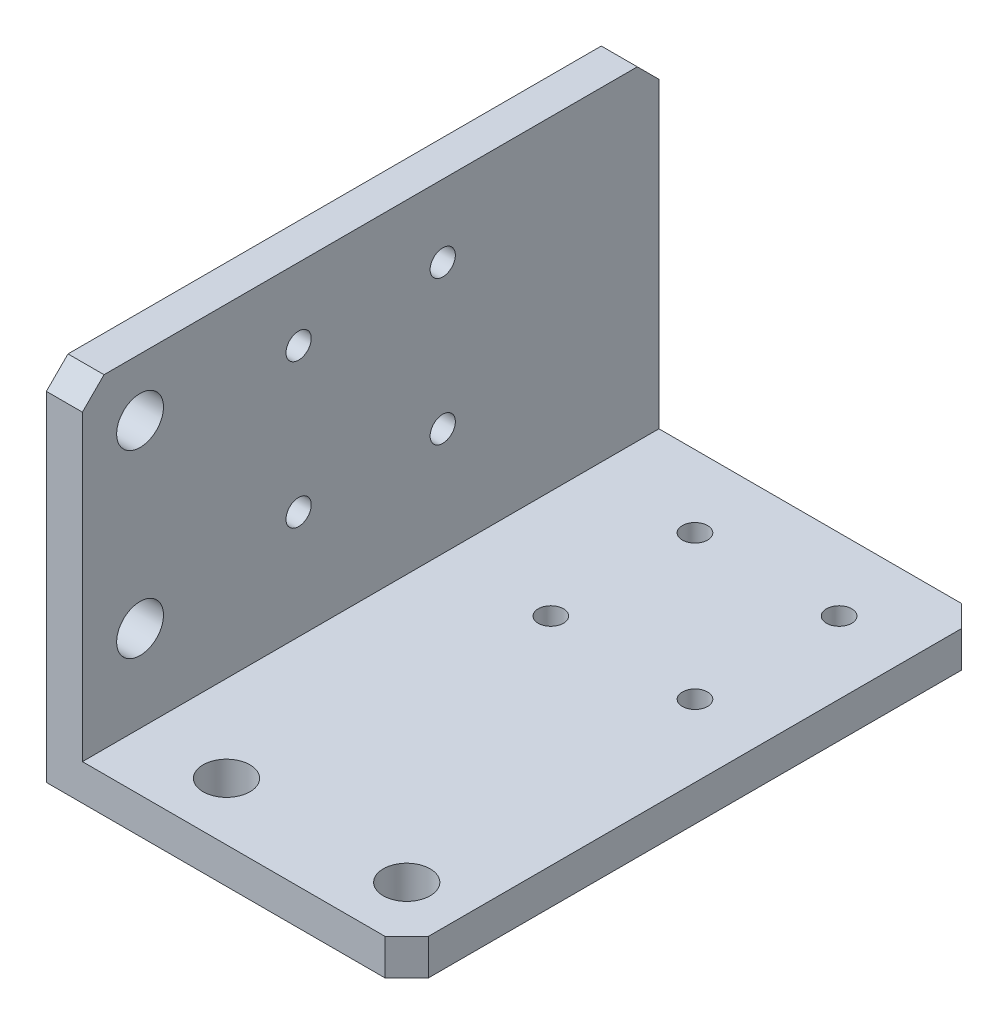
ISO-10303-21;
HEADER;
FILE_DESCRIPTION(('STEP AP214'),'2;1');
FILE_NAME('part.step','',(''),(''),'','','');
FILE_SCHEMA(('AUTOMOTIVE_DESIGN { 1 0 10303 214 1 1 1 1 }'));
ENDSEC;
DATA;
#1=APPLICATION_CONTEXT('core data for automotive mechanical design processes');
#2=APPLICATION_PROTOCOL_DEFINITION('international standard','automotive_design',2000,#1);
#3=PRODUCT_CONTEXT('',#1,'mechanical');
#4=PRODUCT('Part','Part','',(#3));
#5=PRODUCT_RELATED_PRODUCT_CATEGORY('part','',(#4));
#6=PRODUCT_DEFINITION_FORMATION('','',#4);
#7=PRODUCT_DEFINITION_CONTEXT('part definition',#1,'design');
#8=PRODUCT_DEFINITION('design','',#6,#7);
#9=PRODUCT_DEFINITION_SHAPE('','',#8);
#10=(LENGTH_UNIT() NAMED_UNIT(*) SI_UNIT(.MILLI.,.METRE.));
#11=(NAMED_UNIT(*) PLANE_ANGLE_UNIT() SI_UNIT($,.RADIAN.));
#12=(NAMED_UNIT(*) SI_UNIT($,.STERADIAN.) SOLID_ANGLE_UNIT());
#13=UNCERTAINTY_MEASURE_WITH_UNIT(LENGTH_MEASURE(1.E-05),#10,'distance_accuracy_value','');
#14=(GEOMETRIC_REPRESENTATION_CONTEXT(3) GLOBAL_UNCERTAINTY_ASSIGNED_CONTEXT((#13)) GLOBAL_UNIT_ASSIGNED_CONTEXT((#10,
#11,#12)) REPRESENTATION_CONTEXT('',''));
#15=CARTESIAN_POINT('',(0.,0.,0.));
#16=DIRECTION('',(0.,0.,1.));
#17=DIRECTION('',(1.,0.,0.));
#18=AXIS2_PLACEMENT_3D('',#15,#16,#17);
#19=CARTESIAN_POINT('',(50.,0.,80.));
#20=DIRECTION('',(0.,1.,0.));
#21=DIRECTION('',(-1.,0.,0.));
#22=AXIS2_PLACEMENT_3D('',#19,#20,#21);
#23=PLANE('',#22);
#24=CARTESIAN_POINT('',(40.,0.,10.));
#25=DIRECTION('',(0.,-1.,0.));
#26=DIRECTION('',(1.,0.,0.));
#27=AXIS2_PLACEMENT_3D('',#24,#25,#26);
#28=CIRCLE('',#27,1.75000000000001);
#29=CARTESIAN_POINT('',(41.7500000000001,0.,10.));
#30=VERTEX_POINT('',#29);
#31=EDGE_CURVE('E242',#30,#30,#28,.T.);
#32=ORIENTED_EDGE('',*,*,#31,.F.);
#33=EDGE_LOOP('',(#32));
#34=FACE_BOUND('',#33,.T.);
#35=CARTESIAN_POINT('',(40.,0.,30.));
#36=DIRECTION('',(0.,-1.,0.));
#37=DIRECTION('',(1.,0.,0.));
#38=AXIS2_PLACEMENT_3D('',#35,#36,#37);
#39=CIRCLE('',#38,1.75000000000001);
#40=CARTESIAN_POINT('',(41.75,0.,30.));
#41=VERTEX_POINT('',#40);
#42=EDGE_CURVE('E236',#41,#41,#39,.T.);
#43=ORIENTED_EDGE('',*,*,#42,.F.);
#44=EDGE_LOOP('',(#43));
#45=FACE_BOUND('',#44,.T.);
#46=CARTESIAN_POINT('',(20.,0.,30.));
#47=DIRECTION('',(0.,-1.,0.));
#48=DIRECTION('',(1.,0.,0.));
#49=AXIS2_PLACEMENT_3D('',#46,#47,#48);
#50=CIRCLE('',#49,1.75000000000001);
#51=CARTESIAN_POINT('',(21.75,0.,30.));
#52=VERTEX_POINT('',#51);
#53=EDGE_CURVE('E230',#52,#52,#50,.T.);
#54=ORIENTED_EDGE('',*,*,#53,.F.);
#55=EDGE_LOOP('',(#54));
#56=FACE_BOUND('',#55,.T.);
#57=CARTESIAN_POINT('',(20.,0.,9.99999999999996));
#58=DIRECTION('',(0.,-1.,0.));
#59=DIRECTION('',(1.,0.,0.));
#60=AXIS2_PLACEMENT_3D('',#57,#58,#59);
#61=CIRCLE('',#60,1.75);
#62=CARTESIAN_POINT('',(21.75,0.,9.99999999999996));
#63=VERTEX_POINT('',#62);
#64=EDGE_CURVE('E224',#63,#63,#61,.T.);
#65=ORIENTED_EDGE('',*,*,#64,.F.);
#66=EDGE_LOOP('',(#65));
#67=FACE_BOUND('',#66,.T.);
#68=CARTESIAN_POINT('',(17.,0.,72.));
#69=DIRECTION('',(0.,-1.,0.));
#70=DIRECTION('',(0.,0.,-1.));
#71=AXIS2_PLACEMENT_3D('',#68,#69,#70);
#72=CIRCLE('',#71,3.24999999999999);
#73=CARTESIAN_POINT('',(17.,0.,68.75));
#74=VERTEX_POINT('',#73);
#75=EDGE_CURVE('E206',#74,#74,#72,.T.);
#76=ORIENTED_EDGE('',*,*,#75,.F.);
#77=EDGE_LOOP('',(#76));
#78=FACE_BOUND('',#77,.T.);
#79=CARTESIAN_POINT('',(42.,0.,72.));
#80=DIRECTION('',(0.,-1.,0.));
#81=DIRECTION('',(0.,0.,-1.));
#82=AXIS2_PLACEMENT_3D('',#79,#80,#81);
#83=CIRCLE('',#82,3.24999999999999);
#84=CARTESIAN_POINT('',(42.,0.,68.75));
#85=VERTEX_POINT('',#84);
#86=EDGE_CURVE('E166',#85,#85,#83,.T.);
#87=ORIENTED_EDGE('',*,*,#86,.F.);
#88=EDGE_LOOP('',(#87));
#89=FACE_BOUND('',#88,.T.);
#90=DIRECTION('',(1.,0.,0.));
#91=VECTOR('',#90,1.);
#92=CARTESIAN_POINT('',(50.,0.,0.));
#93=LINE('',#92,#91);
#94=CARTESIAN_POINT('',(0.,0.,0.));
#95=VERTEX_POINT('',#94);
#96=CARTESIAN_POINT('',(47.,0.,0.));
#97=VERTEX_POINT('',#96);
#98=EDGE_CURVE('E143',#95,#97,#93,.T.);
#99=ORIENTED_EDGE('',*,*,#98,.T.);
#100=DIRECTION('',(0.707106781186548,0.,0.707106781186548));
#101=VECTOR('',#100,1.);
#102=CARTESIAN_POINT('',(50.,0.,3.00000000000002));
#103=LINE('',#102,#101);
#104=CARTESIAN_POINT('',(50.,0.,3.00000000000004));
#105=VERTEX_POINT('',#104);
#106=EDGE_CURVE('E191',#97,#105,#103,.T.);
#107=ORIENTED_EDGE('',*,*,#106,.T.);
#108=DIRECTION('',(0.,0.,-1.));
#109=VECTOR('',#108,1.);
#110=CARTESIAN_POINT('',(50.,0.,80.));
#111=LINE('',#110,#109);
#112=CARTESIAN_POINT('',(50.,0.,77.));
#113=VERTEX_POINT('',#112);
#114=EDGE_CURVE('E160',#113,#105,#111,.T.);
#115=ORIENTED_EDGE('',*,*,#114,.F.);
#116=DIRECTION('',(0.707106781186544,0.,-0.707106781186551));
#117=VECTOR('',#116,1.);
#118=CARTESIAN_POINT('',(47.,0.,80.));
#119=LINE('',#118,#117);
#120=CARTESIAN_POINT('',(47.,0.,80.));
#121=VERTEX_POINT('',#120);
#122=EDGE_CURVE('E47',#113,#121,#119,.F.);
#123=ORIENTED_EDGE('',*,*,#122,.T.);
#124=DIRECTION('',(1.,0.,0.));
#125=VECTOR('',#124,1.);
#126=CARTESIAN_POINT('',(50.,0.,80.));
#127=LINE('',#126,#125);
#128=CARTESIAN_POINT('',(0.,0.,80.));
#129=VERTEX_POINT('',#128);
#130=EDGE_CURVE('E119',#129,#121,#127,.T.);
#131=ORIENTED_EDGE('',*,*,#130,.F.);
#132=DIRECTION('',(0.,0.,-1.));
#133=VECTOR('',#132,1.);
#134=CARTESIAN_POINT('',(0.,0.,80.));
#135=LINE('',#134,#133);
#136=EDGE_CURVE('E139',#129,#95,#135,.T.);
#137=ORIENTED_EDGE('',*,*,#136,.T.);
#138=EDGE_LOOP('',(#99,#107,#115,#123,#131,#137));
#139=FACE_BOUND('',#138,.T.);
#140=ADVANCED_FACE('F32',(#34,#45,#56,#67,#78,#89,#139),#23,.F.);
#141=CARTESIAN_POINT('',(50.,5.,80.));
#142=DIRECTION('',(-1.,0.,0.));
#143=DIRECTION('',(0.,0.,1.));
#144=AXIS2_PLACEMENT_3D('',#141,#142,#143);
#145=PLANE('',#144);
#146=ORIENTED_EDGE('',*,*,#114,.T.);
#147=DIRECTION('',(0.,1.,0.));
#148=VECTOR('',#147,1.);
#149=CARTESIAN_POINT('',(50.,5.,3.00000000000002));
#150=LINE('',#149,#148);
#151=CARTESIAN_POINT('',(50.,5.,3.00000000000004));
#152=VERTEX_POINT('',#151);
#153=EDGE_CURVE('E184',#105,#152,#150,.T.);
#154=ORIENTED_EDGE('',*,*,#153,.T.);
#155=DIRECTION('',(0.,0.,-1.));
#156=VECTOR('',#155,1.);
#157=CARTESIAN_POINT('',(50.,5.,80.));
#158=LINE('',#157,#156);
#159=CARTESIAN_POINT('',(50.,5.,77.));
#160=VERTEX_POINT('',#159);
#161=EDGE_CURVE('E130',#160,#152,#158,.T.);
#162=ORIENTED_EDGE('',*,*,#161,.F.);
#163=DIRECTION('',(0.,-1.,0.));
#164=VECTOR('',#163,1.);
#165=CARTESIAN_POINT('',(50.,5.,77.));
#166=LINE('',#165,#164);
#167=EDGE_CURVE('E182',#160,#113,#166,.T.);
#168=ORIENTED_EDGE('',*,*,#167,.T.);
#169=EDGE_LOOP('',(#146,#154,#162,#168));
#170=FACE_BOUND('',#169,.T.);
#171=ADVANCED_FACE('F305',(#170),#145,.F.);
#172=CARTESIAN_POINT('',(5.00000000000001,5.,80.));
#173=DIRECTION('',(0.,-1.,0.));
#174=DIRECTION('',(1.,0.,0.));
#175=AXIS2_PLACEMENT_3D('',#172,#173,#174);
#176=PLANE('',#175);
#177=CARTESIAN_POINT('',(40.0000000000001,5.,10.));
#178=DIRECTION('',(0.,-1.,0.));
#179=DIRECTION('',(1.,0.,0.));
#180=AXIS2_PLACEMENT_3D('',#177,#178,#179);
#181=CIRCLE('',#180,1.75000000000001);
#182=CARTESIAN_POINT('',(41.7500000000001,5.,10.));
#183=VERTEX_POINT('',#182);
#184=EDGE_CURVE('E239',#183,#183,#181,.F.);
#185=ORIENTED_EDGE('',*,*,#184,.F.);
#186=EDGE_LOOP('',(#185));
#187=FACE_BOUND('',#186,.T.);
#188=CARTESIAN_POINT('',(40.,5.,30.));
#189=DIRECTION('',(0.,-1.,0.));
#190=DIRECTION('',(1.,0.,0.));
#191=AXIS2_PLACEMENT_3D('',#188,#189,#190);
#192=CIRCLE('',#191,1.75000000000001);
#193=CARTESIAN_POINT('',(41.75,5.,30.));
#194=VERTEX_POINT('',#193);
#195=EDGE_CURVE('E233',#194,#194,#192,.F.);
#196=ORIENTED_EDGE('',*,*,#195,.F.);
#197=EDGE_LOOP('',(#196));
#198=FACE_BOUND('',#197,.T.);
#199=CARTESIAN_POINT('',(20.,5.,30.));
#200=DIRECTION('',(0.,-1.,0.));
#201=DIRECTION('',(1.,0.,0.));
#202=AXIS2_PLACEMENT_3D('',#199,#200,#201);
#203=CIRCLE('',#202,1.75000000000001);
#204=CARTESIAN_POINT('',(21.75,5.,30.));
#205=VERTEX_POINT('',#204);
#206=EDGE_CURVE('E227',#205,#205,#203,.F.);
#207=ORIENTED_EDGE('',*,*,#206,.F.);
#208=EDGE_LOOP('',(#207));
#209=FACE_BOUND('',#208,.T.);
#210=CARTESIAN_POINT('',(20.,5.,9.99999999999996));
#211=DIRECTION('',(0.,-1.,0.));
#212=DIRECTION('',(1.,0.,0.));
#213=AXIS2_PLACEMENT_3D('',#210,#211,#212);
#214=CIRCLE('',#213,1.75);
#215=CARTESIAN_POINT('',(21.75,5.,9.99999999999996));
#216=VERTEX_POINT('',#215);
#217=EDGE_CURVE('E221',#216,#216,#214,.F.);
#218=ORIENTED_EDGE('',*,*,#217,.F.);
#219=EDGE_LOOP('',(#218));
#220=FACE_BOUND('',#219,.T.);
#221=CARTESIAN_POINT('',(17.,5.,72.));
#222=DIRECTION('',(0.,-1.,0.));
#223=DIRECTION('',(1.,0.,0.));
#224=AXIS2_PLACEMENT_3D('',#221,#222,#223);
#225=CIRCLE('',#224,3.24999999999999);
#226=CARTESIAN_POINT('',(20.25,5.,72.));
#227=VERTEX_POINT('',#226);
#228=EDGE_CURVE('E203',#227,#227,#225,.T.);
#229=ORIENTED_EDGE('',*,*,#228,.T.);
#230=EDGE_LOOP('',(#229));
#231=FACE_BOUND('',#230,.T.);
#232=CARTESIAN_POINT('',(42.,5.,72.));
#233=DIRECTION('',(0.,-1.,0.));
#234=DIRECTION('',(1.,0.,0.));
#235=AXIS2_PLACEMENT_3D('',#232,#233,#234);
#236=CIRCLE('',#235,3.24999999999999);
#237=CARTESIAN_POINT('',(45.25,5.,72.));
#238=VERTEX_POINT('',#237);
#239=EDGE_CURVE('E146',#238,#238,#236,.T.);
#240=ORIENTED_EDGE('',*,*,#239,.T.);
#241=EDGE_LOOP('',(#240));
#242=FACE_BOUND('',#241,.T.);
#243=ORIENTED_EDGE('',*,*,#161,.T.);
#244=DIRECTION('',(-0.707106781186548,0.,-0.707106781186548));
#245=VECTOR('',#244,1.);
#246=CARTESIAN_POINT('',(50.,5.,3.00000000000002));
#247=LINE('',#246,#245);
#248=CARTESIAN_POINT('',(47.,5.,0.));
#249=VERTEX_POINT('',#248);
#250=EDGE_CURVE('E188',#152,#249,#247,.T.);
#251=ORIENTED_EDGE('',*,*,#250,.T.);
#252=DIRECTION('',(-1.,0.,0.));
#253=VECTOR('',#252,1.);
#254=CARTESIAN_POINT('',(5.00000000000001,5.,0.));
#255=LINE('',#254,#253);
#256=CARTESIAN_POINT('',(5.00000000000001,5.,0.));
#257=VERTEX_POINT('',#256);
#258=EDGE_CURVE('E126',#249,#257,#255,.T.);
#259=ORIENTED_EDGE('',*,*,#258,.T.);
#260=DIRECTION('',(0.,0.,-1.));
#261=VECTOR('',#260,1.);
#262=CARTESIAN_POINT('',(5.00000000000001,5.,80.));
#263=LINE('',#262,#261);
#264=CARTESIAN_POINT('',(5.00000000000001,5.,80.));
#265=VERTEX_POINT('',#264);
#266=EDGE_CURVE('E122',#265,#257,#263,.T.);
#267=ORIENTED_EDGE('',*,*,#266,.F.);
#268=DIRECTION('',(-1.,0.,0.));
#269=VECTOR('',#268,1.);
#270=CARTESIAN_POINT('',(5.00000000000001,5.,80.));
#271=LINE('',#270,#269);
#272=CARTESIAN_POINT('',(47.,5.,80.));
#273=VERTEX_POINT('',#272);
#274=EDGE_CURVE('E111',#273,#265,#271,.T.);
#275=ORIENTED_EDGE('',*,*,#274,.F.);
#276=DIRECTION('',(-0.707106781186544,0.,0.707106781186551));
#277=VECTOR('',#276,1.);
#278=CARTESIAN_POINT('',(47.,5.,80.));
#279=LINE('',#278,#277);
#280=EDGE_CURVE('E55',#273,#160,#279,.F.);
#281=ORIENTED_EDGE('',*,*,#280,.T.);
#282=EDGE_LOOP('',(#243,#251,#259,#267,#275,#281));
#283=FACE_BOUND('',#282,.T.);
#284=ADVANCED_FACE('F124',(#187,#198,#209,#220,#231,#242,#283),#176,.F.);
#285=CARTESIAN_POINT('',(5.,50.,80.));
#286=DIRECTION('',(-1.,0.,0.));
#287=DIRECTION('',(0.,-1.,0.));
#288=AXIS2_PLACEMENT_3D('',#285,#286,#287);
#289=PLANE('',#288);
#290=CARTESIAN_POINT('',(5.,20.,30.));
#291=DIRECTION('',(-1.,0.,0.));
#292=DIRECTION('',(0.,-1.,0.));
#293=AXIS2_PLACEMENT_3D('',#290,#291,#292);
#294=CIRCLE('',#293,1.75000000000001);
#295=CARTESIAN_POINT('',(5.,18.25,30.));
#296=VERTEX_POINT('',#295);
#297=EDGE_CURVE('E263',#296,#296,#294,.F.);
#298=ORIENTED_EDGE('',*,*,#297,.F.);
#299=EDGE_LOOP('',(#298));
#300=FACE_BOUND('',#299,.T.);
#301=CARTESIAN_POINT('',(5.,20.,50.));
#302=DIRECTION('',(-1.,0.,0.));
#303=DIRECTION('',(0.,-1.,0.));
#304=AXIS2_PLACEMENT_3D('',#301,#302,#303);
#305=CIRCLE('',#304,1.75);
#306=CARTESIAN_POINT('',(5.,18.25,50.));
#307=VERTEX_POINT('',#306);
#308=EDGE_CURVE('E257',#307,#307,#305,.F.);
#309=ORIENTED_EDGE('',*,*,#308,.F.);
#310=EDGE_LOOP('',(#309));
#311=FACE_BOUND('',#310,.T.);
#312=CARTESIAN_POINT('',(5.,40.,50.));
#313=DIRECTION('',(-1.,0.,0.));
#314=DIRECTION('',(0.,-1.,0.));
#315=AXIS2_PLACEMENT_3D('',#312,#313,#314);
#316=CIRCLE('',#315,1.75000000000001);
#317=CARTESIAN_POINT('',(5.,38.25,50.));
#318=VERTEX_POINT('',#317);
#319=EDGE_CURVE('E251',#318,#318,#316,.F.);
#320=ORIENTED_EDGE('',*,*,#319,.F.);
#321=EDGE_LOOP('',(#320));
#322=FACE_BOUND('',#321,.T.);
#323=CARTESIAN_POINT('',(5.,40.,30.));
#324=DIRECTION('',(-1.,0.,0.));
#325=DIRECTION('',(0.,-1.,0.));
#326=AXIS2_PLACEMENT_3D('',#323,#324,#325);
#327=CIRCLE('',#326,1.75);
#328=CARTESIAN_POINT('',(5.,38.25,30.));
#329=VERTEX_POINT('',#328);
#330=EDGE_CURVE('E245',#329,#329,#327,.F.);
#331=ORIENTED_EDGE('',*,*,#330,.F.);
#332=EDGE_LOOP('',(#331));
#333=FACE_BOUND('',#332,.T.);
#334=CARTESIAN_POINT('',(5.,42.,72.));
#335=DIRECTION('',(-1.,0.,0.));
#336=DIRECTION('',(0.,0.,1.));
#337=AXIS2_PLACEMENT_3D('',#334,#335,#336);
#338=CIRCLE('',#337,3.25);
#339=CARTESIAN_POINT('',(5.,42.,75.25));
#340=VERTEX_POINT('',#339);
#341=EDGE_CURVE('E215',#340,#340,#338,.T.);
#342=ORIENTED_EDGE('',*,*,#341,.T.);
#343=EDGE_LOOP('',(#342));
#344=FACE_BOUND('',#343,.T.);
#345=CARTESIAN_POINT('',(5.,17.,72.));
#346=DIRECTION('',(-1.,0.,0.));
#347=DIRECTION('',(0.,0.,1.));
#348=AXIS2_PLACEMENT_3D('',#345,#346,#347);
#349=CIRCLE('',#348,3.25);
#350=CARTESIAN_POINT('',(5.,17.,75.25));
#351=VERTEX_POINT('',#350);
#352=EDGE_CURVE('E209',#351,#351,#349,.T.);
#353=ORIENTED_EDGE('',*,*,#352,.T.);
#354=EDGE_LOOP('',(#353));
#355=FACE_BOUND('',#354,.T.);
#356=DIRECTION('',(0.,1.,0.));
#357=VECTOR('',#356,1.);
#358=CARTESIAN_POINT('',(5.,50.,0.));
#359=LINE('',#358,#357);
#360=CARTESIAN_POINT('',(5.,47.,0.));
#361=VERTEX_POINT('',#360);
#362=EDGE_CURVE('E148',#257,#361,#359,.T.);
#363=ORIENTED_EDGE('',*,*,#362,.T.);
#364=DIRECTION('',(0.,0.707106781186548,0.707106781186548));
#365=VECTOR('',#364,1.);
#366=CARTESIAN_POINT('',(5.,50.,3.00000000000002));
#367=LINE('',#366,#365);
#368=CARTESIAN_POINT('',(5.,50.,3.00000000000004));
#369=VERTEX_POINT('',#368);
#370=EDGE_CURVE('E180',#361,#369,#367,.T.);
#371=ORIENTED_EDGE('',*,*,#370,.T.);
#372=DIRECTION('',(0.,0.,-1.));
#373=VECTOR('',#372,1.);
#374=CARTESIAN_POINT('',(5.,50.,80.));
#375=LINE('',#374,#373);
#376=CARTESIAN_POINT('',(5.,50.,77.));
#377=VERTEX_POINT('',#376);
#378=EDGE_CURVE('E131',#377,#369,#375,.T.);
#379=ORIENTED_EDGE('',*,*,#378,.F.);
#380=DIRECTION('',(0.,0.707106781186544,-0.707106781186551));
#381=VECTOR('',#380,1.);
#382=CARTESIAN_POINT('',(5.,47.,80.));
#383=LINE('',#382,#381);
#384=CARTESIAN_POINT('',(5.,47.,80.));
#385=VERTEX_POINT('',#384);
#386=EDGE_CURVE('E136',#377,#385,#383,.F.);
#387=ORIENTED_EDGE('',*,*,#386,.T.);
#388=DIRECTION('',(0.,1.,0.));
#389=VECTOR('',#388,1.);
#390=CARTESIAN_POINT('',(5.,50.,80.));
#391=LINE('',#390,#389);
#392=EDGE_CURVE('E116',#265,#385,#391,.T.);
#393=ORIENTED_EDGE('',*,*,#392,.F.);
#394=ORIENTED_EDGE('',*,*,#266,.T.);
#395=EDGE_LOOP('',(#363,#371,#379,#387,#393,#394));
#396=FACE_BOUND('',#395,.T.);
#397=ADVANCED_FACE('F133',(#300,#311,#322,#333,#344,#355,#396),#289,.F.);
#398=CARTESIAN_POINT('',(0.,50.,80.));
#399=DIRECTION('',(0.,-1.,0.));
#400=DIRECTION('',(0.,0.,-1.));
#401=AXIS2_PLACEMENT_3D('',#398,#399,#400);
#402=PLANE('',#401);
#403=ORIENTED_EDGE('',*,*,#378,.T.);
#404=DIRECTION('',(-1.,0.,0.));
#405=VECTOR('',#404,1.);
#406=CARTESIAN_POINT('',(0.,50.,3.00000000000002));
#407=LINE('',#406,#405);
#408=CARTESIAN_POINT('',(0.,50.,3.00000000000004));
#409=VERTEX_POINT('',#408);
#410=EDGE_CURVE('E168',#369,#409,#407,.T.);
#411=ORIENTED_EDGE('',*,*,#410,.T.);
#412=DIRECTION('',(0.,0.,-1.));
#413=VECTOR('',#412,1.);
#414=CARTESIAN_POINT('',(0.,50.,80.));
#415=LINE('',#414,#413);
#416=CARTESIAN_POINT('',(0.,50.,77.));
#417=VERTEX_POINT('',#416);
#418=EDGE_CURVE('E154',#417,#409,#415,.T.);
#419=ORIENTED_EDGE('',*,*,#418,.F.);
#420=DIRECTION('',(1.,0.,0.));
#421=VECTOR('',#420,1.);
#422=CARTESIAN_POINT('',(0.,50.,77.));
#423=LINE('',#422,#421);
#424=EDGE_CURVE('E163',#417,#377,#423,.T.);
#425=ORIENTED_EDGE('',*,*,#424,.T.);
#426=EDGE_LOOP('',(#403,#411,#419,#425));
#427=FACE_BOUND('',#426,.T.);
#428=ADVANCED_FACE('F275',(#427),#402,.F.);
#429=CARTESIAN_POINT('',(0.,0.,80.));
#430=DIRECTION('',(1.,0.,0.));
#431=DIRECTION('',(0.,0.,-1.));
#432=AXIS2_PLACEMENT_3D('',#429,#430,#431);
#433=PLANE('',#432);
#434=CARTESIAN_POINT('',(0.,20.,30.));
#435=DIRECTION('',(-1.,0.,0.));
#436=DIRECTION('',(0.,0.,1.));
#437=AXIS2_PLACEMENT_3D('',#434,#435,#436);
#438=CIRCLE('',#437,1.75000000000001);
#439=CARTESIAN_POINT('',(0.,20.,31.75));
#440=VERTEX_POINT('',#439);
#441=EDGE_CURVE('E266',#440,#440,#438,.T.);
#442=ORIENTED_EDGE('',*,*,#441,.F.);
#443=EDGE_LOOP('',(#442));
#444=FACE_BOUND('',#443,.T.);
#445=CARTESIAN_POINT('',(0.,20.,50.));
#446=DIRECTION('',(-1.,0.,0.));
#447=DIRECTION('',(0.,0.,1.));
#448=AXIS2_PLACEMENT_3D('',#445,#446,#447);
#449=CIRCLE('',#448,1.75);
#450=CARTESIAN_POINT('',(0.,20.,51.75));
#451=VERTEX_POINT('',#450);
#452=EDGE_CURVE('E260',#451,#451,#449,.T.);
#453=ORIENTED_EDGE('',*,*,#452,.F.);
#454=EDGE_LOOP('',(#453));
#455=FACE_BOUND('',#454,.T.);
#456=CARTESIAN_POINT('',(0.,40.,50.));
#457=DIRECTION('',(-1.,0.,0.));
#458=DIRECTION('',(0.,0.,1.));
#459=AXIS2_PLACEMENT_3D('',#456,#457,#458);
#460=CIRCLE('',#459,1.75000000000001);
#461=CARTESIAN_POINT('',(0.,40.,51.75));
#462=VERTEX_POINT('',#461);
#463=EDGE_CURVE('E254',#462,#462,#460,.T.);
#464=ORIENTED_EDGE('',*,*,#463,.F.);
#465=EDGE_LOOP('',(#464));
#466=FACE_BOUND('',#465,.T.);
#467=CARTESIAN_POINT('',(0.,40.,30.));
#468=DIRECTION('',(-1.,0.,0.));
#469=DIRECTION('',(0.,0.,1.));
#470=AXIS2_PLACEMENT_3D('',#467,#468,#469);
#471=CIRCLE('',#470,1.75);
#472=CARTESIAN_POINT('',(0.,40.,31.75));
#473=VERTEX_POINT('',#472);
#474=EDGE_CURVE('E248',#473,#473,#471,.T.);
#475=ORIENTED_EDGE('',*,*,#474,.F.);
#476=EDGE_LOOP('',(#475));
#477=FACE_BOUND('',#476,.T.);
#478=CARTESIAN_POINT('',(0.,42.,72.));
#479=DIRECTION('',(-1.,0.,0.));
#480=DIRECTION('',(0.,0.,1.));
#481=AXIS2_PLACEMENT_3D('',#478,#479,#480);
#482=CIRCLE('',#481,3.24999999999999);
#483=CARTESIAN_POINT('',(0.,42.,75.25));
#484=VERTEX_POINT('',#483);
#485=EDGE_CURVE('E218',#484,#484,#482,.T.);
#486=ORIENTED_EDGE('',*,*,#485,.F.);
#487=EDGE_LOOP('',(#486));
#488=FACE_BOUND('',#487,.T.);
#489=CARTESIAN_POINT('',(0.,17.,72.));
#490=DIRECTION('',(-1.,0.,0.));
#491=DIRECTION('',(0.,0.,1.));
#492=AXIS2_PLACEMENT_3D('',#489,#490,#491);
#493=CIRCLE('',#492,3.24999999999999);
#494=CARTESIAN_POINT('',(0.,17.,75.25));
#495=VERTEX_POINT('',#494);
#496=EDGE_CURVE('E212',#495,#495,#493,.T.);
#497=ORIENTED_EDGE('',*,*,#496,.F.);
#498=EDGE_LOOP('',(#497));
#499=FACE_BOUND('',#498,.T.);
#500=ORIENTED_EDGE('',*,*,#418,.T.);
#501=DIRECTION('',(0.,-0.707106781186548,-0.707106781186548));
#502=VECTOR('',#501,1.);
#503=CARTESIAN_POINT('',(0.,50.,3.00000000000002));
#504=LINE('',#503,#502);
#505=CARTESIAN_POINT('',(0.,47.,0.));
#506=VERTEX_POINT('',#505);
#507=EDGE_CURVE('E173',#409,#506,#504,.T.);
#508=ORIENTED_EDGE('',*,*,#507,.T.);
#509=DIRECTION('',(0.,-1.,0.));
#510=VECTOR('',#509,1.);
#511=CARTESIAN_POINT('',(0.,0.,0.));
#512=LINE('',#511,#510);
#513=EDGE_CURVE('E150',#506,#95,#512,.T.);
#514=ORIENTED_EDGE('',*,*,#513,.T.);
#515=ORIENTED_EDGE('',*,*,#136,.F.);
#516=DIRECTION('',(0.,-1.,0.));
#517=VECTOR('',#516,1.);
#518=CARTESIAN_POINT('',(0.,0.,80.));
#519=LINE('',#518,#517);
#520=CARTESIAN_POINT('',(0.,47.,80.));
#521=VERTEX_POINT('',#520);
#522=EDGE_CURVE('E137',#521,#129,#519,.T.);
#523=ORIENTED_EDGE('',*,*,#522,.F.);
#524=DIRECTION('',(0.,-0.707106781186544,0.707106781186551));
#525=VECTOR('',#524,1.);
#526=CARTESIAN_POINT('',(0.,47.,80.));
#527=LINE('',#526,#525);
#528=EDGE_CURVE('E171',#521,#417,#527,.F.);
#529=ORIENTED_EDGE('',*,*,#528,.T.);
#530=EDGE_LOOP('',(#500,#508,#514,#515,#523,#529));
#531=FACE_BOUND('',#530,.T.);
#532=ADVANCED_FACE('F196',(#444,#455,#466,#477,#488,#499,#531),#433,.F.);
#533=CARTESIAN_POINT('',(0.,0.,80.));
#534=DIRECTION('',(0.,0.,-1.));
#535=DIRECTION('',(-1.,0.,0.));
#536=AXIS2_PLACEMENT_3D('',#533,#534,#535);
#537=PLANE('',#536);
#538=ORIENTED_EDGE('',*,*,#130,.T.);
#539=DIRECTION('',(0.,1.,0.));
#540=VECTOR('',#539,1.);
#541=CARTESIAN_POINT('',(47.,0.,80.));
#542=LINE('',#541,#540);
#543=EDGE_CURVE('E11',#121,#273,#542,.T.);
#544=ORIENTED_EDGE('',*,*,#543,.T.);
#545=ORIENTED_EDGE('',*,*,#274,.T.);
#546=ORIENTED_EDGE('',*,*,#392,.T.);
#547=DIRECTION('',(-1.,0.,0.));
#548=VECTOR('',#547,1.);
#549=CARTESIAN_POINT('',(0.,47.,80.));
#550=LINE('',#549,#548);
#551=EDGE_CURVE('E40',#385,#521,#550,.T.);
#552=ORIENTED_EDGE('',*,*,#551,.T.);
#553=ORIENTED_EDGE('',*,*,#522,.T.);
#554=EDGE_LOOP('',(#538,#544,#545,#546,#552,#553));
#555=FACE_BOUND('',#554,.T.);
#556=ADVANCED_FACE('F113',(#555),#537,.F.);
#557=CARTESIAN_POINT('',(0.,0.,0.));
#558=DIRECTION('',(0.,0.,-1.));
#559=DIRECTION('',(-1.,0.,0.));
#560=AXIS2_PLACEMENT_3D('',#557,#558,#559);
#561=PLANE('',#560);
#562=ORIENTED_EDGE('',*,*,#513,.F.);
#563=DIRECTION('',(1.,0.,0.));
#564=VECTOR('',#563,1.);
#565=CARTESIAN_POINT('',(5.,47.,0.));
#566=LINE('',#565,#564);
#567=EDGE_CURVE('E177',#506,#361,#566,.T.);
#568=ORIENTED_EDGE('',*,*,#567,.T.);
#569=ORIENTED_EDGE('',*,*,#362,.F.);
#570=ORIENTED_EDGE('',*,*,#258,.F.);
#571=DIRECTION('',(0.,-1.,0.));
#572=VECTOR('',#571,1.);
#573=CARTESIAN_POINT('',(47.,0.,0.));
#574=LINE('',#573,#572);
#575=EDGE_CURVE('E175',#249,#97,#574,.T.);
#576=ORIENTED_EDGE('',*,*,#575,.T.);
#577=ORIENTED_EDGE('',*,*,#98,.F.);
#578=EDGE_LOOP('',(#562,#568,#569,#570,#576,#577));
#579=FACE_BOUND('',#578,.T.);
#580=ADVANCED_FACE('F334',(#579),#561,.T.);
#581=CARTESIAN_POINT('',(42.,0.,72.));
#582=DIRECTION('',(0.,-1.,0.));
#583=DIRECTION('',(0.,0.,-1.));
#584=AXIS2_PLACEMENT_3D('',#581,#582,#583);
#585=CYLINDRICAL_SURFACE('',#584,3.24999999999999);
#586=ORIENTED_EDGE('',*,*,#86,.T.);
#587=EDGE_LOOP('',(#586));
#588=FACE_BOUND('',#587,.T.);
#589=ORIENTED_EDGE('',*,*,#239,.F.);
#590=EDGE_LOOP('',(#589));
#591=FACE_BOUND('',#590,.T.);
#592=ADVANCED_FACE('F300',(#588,#591),#585,.F.);
#593=CARTESIAN_POINT('',(17.,0.,72.));
#594=DIRECTION('',(0.,-1.,0.));
#595=DIRECTION('',(0.,0.,-1.));
#596=AXIS2_PLACEMENT_3D('',#593,#594,#595);
#597=CYLINDRICAL_SURFACE('',#596,3.24999999999999);
#598=ORIENTED_EDGE('',*,*,#75,.T.);
#599=EDGE_LOOP('',(#598));
#600=FACE_BOUND('',#599,.T.);
#601=ORIENTED_EDGE('',*,*,#228,.F.);
#602=EDGE_LOOP('',(#601));
#603=FACE_BOUND('',#602,.T.);
#604=ADVANCED_FACE('F290',(#600,#603),#597,.F.);
#605=CARTESIAN_POINT('',(0.,17.,72.));
#606=DIRECTION('',(-1.,0.,0.));
#607=DIRECTION('',(0.,0.,1.));
#608=AXIS2_PLACEMENT_3D('',#605,#606,#607);
#609=CYLINDRICAL_SURFACE('',#608,3.24999999999999);
#610=ORIENTED_EDGE('',*,*,#352,.F.);
#611=EDGE_LOOP('',(#610));
#612=FACE_BOUND('',#611,.T.);
#613=ORIENTED_EDGE('',*,*,#496,.T.);
#614=EDGE_LOOP('',(#613));
#615=FACE_BOUND('',#614,.T.);
#616=ADVANCED_FACE('F287',(#612,#615),#609,.F.);
#617=CARTESIAN_POINT('',(0.,42.,72.));
#618=DIRECTION('',(-1.,0.,0.));
#619=DIRECTION('',(0.,0.,1.));
#620=AXIS2_PLACEMENT_3D('',#617,#618,#619);
#621=CYLINDRICAL_SURFACE('',#620,3.24999999999999);
#622=ORIENTED_EDGE('',*,*,#341,.F.);
#623=EDGE_LOOP('',(#622));
#624=FACE_BOUND('',#623,.T.);
#625=ORIENTED_EDGE('',*,*,#485,.T.);
#626=EDGE_LOOP('',(#625));
#627=FACE_BOUND('',#626,.T.);
#628=ADVANCED_FACE('F289',(#624,#627),#621,.F.);
#629=CARTESIAN_POINT('',(20.,50.001,9.99999999999996));
#630=DIRECTION('',(0.,-1.,0.));
#631=DIRECTION('',(1.,0.,0.));
#632=AXIS2_PLACEMENT_3D('',#629,#630,#631);
#633=CYLINDRICAL_SURFACE('',#632,1.75);
#634=ORIENTED_EDGE('',*,*,#64,.T.);
#635=EDGE_LOOP('',(#634));
#636=FACE_BOUND('',#635,.T.);
#637=ORIENTED_EDGE('',*,*,#217,.T.);
#638=EDGE_LOOP('',(#637));
#639=FACE_BOUND('',#638,.T.);
#640=ADVANCED_FACE('F297',(#636,#639),#633,.F.);
#641=CARTESIAN_POINT('',(20.,50.001,30.));
#642=DIRECTION('',(0.,-1.,0.));
#643=DIRECTION('',(1.,0.,0.));
#644=AXIS2_PLACEMENT_3D('',#641,#642,#643);
#645=CYLINDRICAL_SURFACE('',#644,1.75000000000001);
#646=ORIENTED_EDGE('',*,*,#53,.T.);
#647=EDGE_LOOP('',(#646));
#648=FACE_BOUND('',#647,.T.);
#649=ORIENTED_EDGE('',*,*,#206,.T.);
#650=EDGE_LOOP('',(#649));
#651=FACE_BOUND('',#650,.T.);
#652=ADVANCED_FACE('F450',(#648,#651),#645,.F.);
#653=CARTESIAN_POINT('',(40.,50.001,30.));
#654=DIRECTION('',(0.,-1.,0.));
#655=DIRECTION('',(1.,0.,0.));
#656=AXIS2_PLACEMENT_3D('',#653,#654,#655);
#657=CYLINDRICAL_SURFACE('',#656,1.75000000000001);
#658=ORIENTED_EDGE('',*,*,#42,.T.);
#659=EDGE_LOOP('',(#658));
#660=FACE_BOUND('',#659,.T.);
#661=ORIENTED_EDGE('',*,*,#195,.T.);
#662=EDGE_LOOP('',(#661));
#663=FACE_BOUND('',#662,.T.);
#664=ADVANCED_FACE('F442',(#660,#663),#657,.F.);
#665=CARTESIAN_POINT('',(40.0000000000001,50.001,10.));
#666=DIRECTION('',(0.,-1.,0.));
#667=DIRECTION('',(1.,0.,0.));
#668=AXIS2_PLACEMENT_3D('',#665,#666,#667);
#669=CYLINDRICAL_SURFACE('',#668,1.75000000000001);
#670=ORIENTED_EDGE('',*,*,#31,.T.);
#671=EDGE_LOOP('',(#670));
#672=FACE_BOUND('',#671,.T.);
#673=ORIENTED_EDGE('',*,*,#184,.T.);
#674=EDGE_LOOP('',(#673));
#675=FACE_BOUND('',#674,.T.);
#676=ADVANCED_FACE('F434',(#672,#675),#669,.F.);
#677=CARTESIAN_POINT('',(50.001,40.,30.));
#678=DIRECTION('',(-1.,0.,0.));
#679=DIRECTION('',(0.,0.,1.));
#680=AXIS2_PLACEMENT_3D('',#677,#678,#679);
#681=CYLINDRICAL_SURFACE('',#680,1.75);
#682=ORIENTED_EDGE('',*,*,#474,.T.);
#683=EDGE_LOOP('',(#682));
#684=FACE_BOUND('',#683,.T.);
#685=ORIENTED_EDGE('',*,*,#330,.T.);
#686=EDGE_LOOP('',(#685));
#687=FACE_BOUND('',#686,.T.);
#688=ADVANCED_FACE('F426',(#684,#687),#681,.F.);
#689=CARTESIAN_POINT('',(50.001,40.,50.));
#690=DIRECTION('',(-1.,0.,0.));
#691=DIRECTION('',(0.,0.,1.));
#692=AXIS2_PLACEMENT_3D('',#689,#690,#691);
#693=CYLINDRICAL_SURFACE('',#692,1.75000000000001);
#694=ORIENTED_EDGE('',*,*,#463,.T.);
#695=EDGE_LOOP('',(#694));
#696=FACE_BOUND('',#695,.T.);
#697=ORIENTED_EDGE('',*,*,#319,.T.);
#698=EDGE_LOOP('',(#697));
#699=FACE_BOUND('',#698,.T.);
#700=ADVANCED_FACE('F418',(#696,#699),#693,.F.);
#701=CARTESIAN_POINT('',(50.001,20.,50.));
#702=DIRECTION('',(-1.,0.,0.));
#703=DIRECTION('',(0.,0.,1.));
#704=AXIS2_PLACEMENT_3D('',#701,#702,#703);
#705=CYLINDRICAL_SURFACE('',#704,1.75);
#706=ORIENTED_EDGE('',*,*,#452,.T.);
#707=EDGE_LOOP('',(#706));
#708=FACE_BOUND('',#707,.T.);
#709=ORIENTED_EDGE('',*,*,#308,.T.);
#710=EDGE_LOOP('',(#709));
#711=FACE_BOUND('',#710,.T.);
#712=ADVANCED_FACE('F412',(#708,#711),#705,.F.);
#713=CARTESIAN_POINT('',(50.001,20.,30.));
#714=DIRECTION('',(-1.,0.,0.));
#715=DIRECTION('',(0.,0.,1.));
#716=AXIS2_PLACEMENT_3D('',#713,#714,#715);
#717=CYLINDRICAL_SURFACE('',#716,1.75000000000001);
#718=ORIENTED_EDGE('',*,*,#441,.T.);
#719=EDGE_LOOP('',(#718));
#720=FACE_BOUND('',#719,.T.);
#721=ORIENTED_EDGE('',*,*,#297,.T.);
#722=EDGE_LOOP('',(#721));
#723=FACE_BOUND('',#722,.T.);
#724=ADVANCED_FACE('F270',(#720,#723),#717,.F.);
#725=CARTESIAN_POINT('',(0.,50.,3.00000000000002));
#726=DIRECTION('',(0.,0.707106781186548,-0.707106781186548));
#727=DIRECTION('',(1.,0.,0.));
#728=AXIS2_PLACEMENT_3D('',#725,#726,#727);
#729=PLANE('',#728);
#730=ORIENTED_EDGE('',*,*,#370,.F.);
#731=ORIENTED_EDGE('',*,*,#567,.F.);
#732=ORIENTED_EDGE('',*,*,#507,.F.);
#733=ORIENTED_EDGE('',*,*,#410,.F.);
#734=EDGE_LOOP('',(#730,#731,#732,#733));
#735=FACE_BOUND('',#734,.T.);
#736=ADVANCED_FACE('F317',(#735),#729,.T.);
#737=CARTESIAN_POINT('',(50.,5.,3.00000000000002));
#738=DIRECTION('',(0.707106781186548,0.,-0.707106781186548));
#739=DIRECTION('',(0.,-1.,0.));
#740=AXIS2_PLACEMENT_3D('',#737,#738,#739);
#741=PLANE('',#740);
#742=ORIENTED_EDGE('',*,*,#106,.F.);
#743=ORIENTED_EDGE('',*,*,#575,.F.);
#744=ORIENTED_EDGE('',*,*,#250,.F.);
#745=ORIENTED_EDGE('',*,*,#153,.F.);
#746=EDGE_LOOP('',(#742,#743,#744,#745));
#747=FACE_BOUND('',#746,.T.);
#748=ADVANCED_FACE('F320',(#747),#741,.T.);
#749=CARTESIAN_POINT('',(47.,0.,80.));
#750=DIRECTION('',(-0.707106781186551,0.,-0.707106781186544));
#751=DIRECTION('',(0.,1.,0.));
#752=AXIS2_PLACEMENT_3D('',#749,#750,#751);
#753=PLANE('',#752);
#754=ORIENTED_EDGE('',*,*,#122,.F.);
#755=ORIENTED_EDGE('',*,*,#167,.F.);
#756=ORIENTED_EDGE('',*,*,#280,.F.);
#757=ORIENTED_EDGE('',*,*,#543,.F.);
#758=EDGE_LOOP('',(#754,#755,#756,#757));
#759=FACE_BOUND('',#758,.T.);
#760=ADVANCED_FACE('F323',(#759),#753,.F.);
#761=CARTESIAN_POINT('',(0.,47.,80.));
#762=DIRECTION('',(0.,-0.707106781186551,-0.707106781186544));
#763=DIRECTION('',(-1.,0.,0.));
#764=AXIS2_PLACEMENT_3D('',#761,#762,#763);
#765=PLANE('',#764);
#766=ORIENTED_EDGE('',*,*,#386,.F.);
#767=ORIENTED_EDGE('',*,*,#424,.F.);
#768=ORIENTED_EDGE('',*,*,#528,.F.);
#769=ORIENTED_EDGE('',*,*,#551,.F.);
#770=EDGE_LOOP('',(#766,#767,#768,#769));
#771=FACE_BOUND('',#770,.T.);
#772=ADVANCED_FACE('F34',(#771),#765,.F.);
#773=CLOSED_SHELL('',(#140,#171,#284,#397,#428,#532,#556,#580,#592,#604,#616,#628,#640,#652,
#664,#676,#688,#700,#712,#724,#736,#748,#760,#772));
#774=MANIFOLD_SOLID_BREP('B2',#773);
#775=ADVANCED_BREP_SHAPE_REPRESENTATION('',(#18,#774),#14);
#776=SHAPE_DEFINITION_REPRESENTATION(#9,#775);
ENDSEC;
END-ISO-10303-21;
